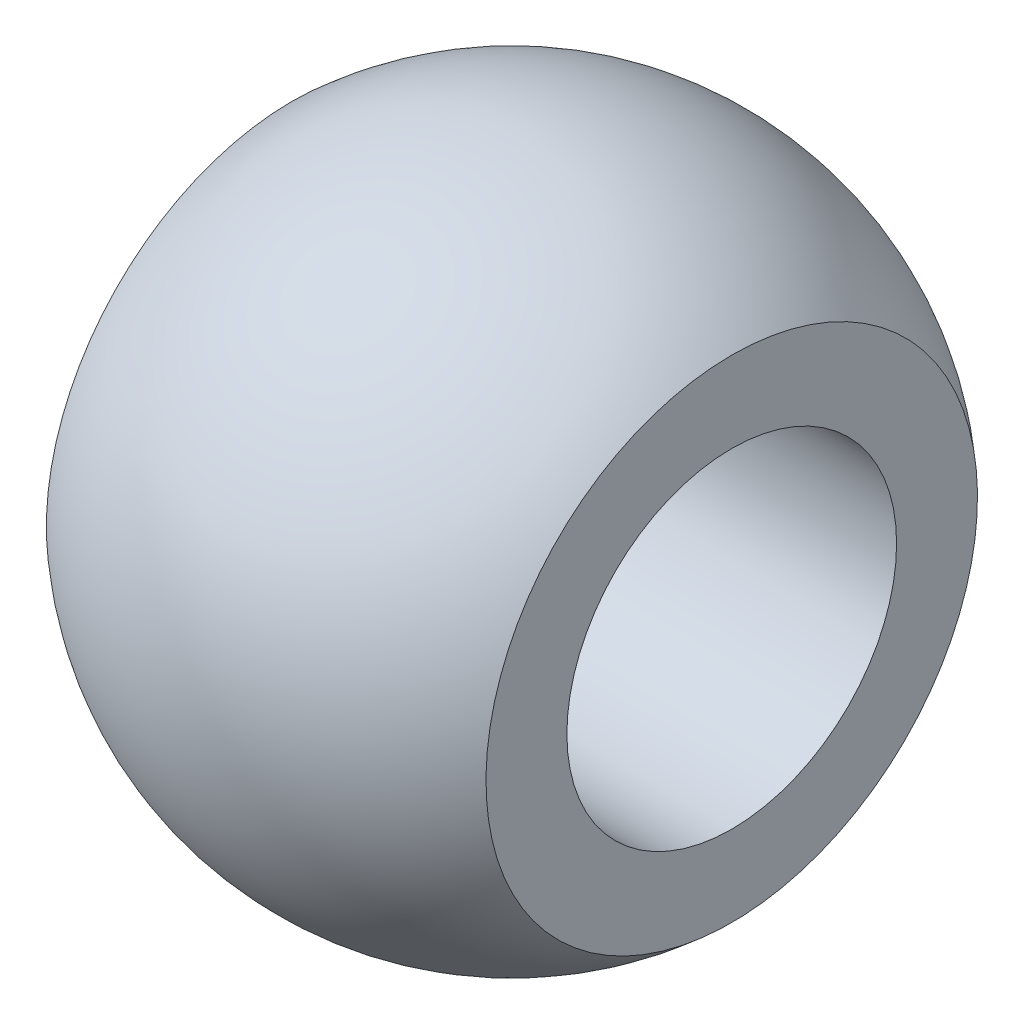
ISO-10303-21;
HEADER;
FILE_DESCRIPTION(('STEP AP214'),'2;1');
FILE_NAME('part.step','',(''),(''),'','','');
FILE_SCHEMA(('AUTOMOTIVE_DESIGN { 1 0 10303 214 1 1 1 1 }'));
ENDSEC;
DATA;
#1=APPLICATION_CONTEXT('core data for automotive mechanical design processes');
#2=APPLICATION_PROTOCOL_DEFINITION('international standard','automotive_design',2000,#1);
#3=PRODUCT_CONTEXT('',#1,'mechanical');
#4=PRODUCT('Part','Part','',(#3));
#5=PRODUCT_RELATED_PRODUCT_CATEGORY('part','',(#4));
#6=PRODUCT_DEFINITION_FORMATION('','',#4);
#7=PRODUCT_DEFINITION_CONTEXT('part definition',#1,'design');
#8=PRODUCT_DEFINITION('design','',#6,#7);
#9=PRODUCT_DEFINITION_SHAPE('','',#8);
#10=(LENGTH_UNIT() NAMED_UNIT(*) SI_UNIT(.MILLI.,.METRE.));
#11=(NAMED_UNIT(*) PLANE_ANGLE_UNIT() SI_UNIT($,.RADIAN.));
#12=(NAMED_UNIT(*) SI_UNIT($,.STERADIAN.) SOLID_ANGLE_UNIT());
#13=UNCERTAINTY_MEASURE_WITH_UNIT(LENGTH_MEASURE(1.E-05),#10,'distance_accuracy_value','');
#14=(GEOMETRIC_REPRESENTATION_CONTEXT(3) GLOBAL_UNCERTAINTY_ASSIGNED_CONTEXT((#13)) GLOBAL_UNIT_ASSIGNED_CONTEXT((#10,
#11,#12)) REPRESENTATION_CONTEXT('',''));
#15=CARTESIAN_POINT('',(0.,0.,0.));
#16=DIRECTION('',(0.,0.,1.));
#17=DIRECTION('',(1.,0.,0.));
#18=AXIS2_PLACEMENT_3D('',#15,#16,#17);
#19=CARTESIAN_POINT('',(0.,0.,0.));
#20=DIRECTION('',(0.,1.,0.));
#21=DIRECTION('',(1.,0.,0.));
#22=AXIS2_PLACEMENT_3D('',#19,#20,#21);
#23=SPHERICAL_SURFACE('',#22,12.);
#24=CARTESIAN_POINT('',(0.,0.,0.));
#25=DIRECTION('',(1.,0.,0.));
#26=DIRECTION('',(0.,1.,0.));
#27=AXIS2_PLACEMENT_3D('',#24,#25,#26);
#28=SPHERICAL_SURFACE('',#27,12.);
#29=CARTESIAN_POINT('',(8.,0.,0.));
#30=DIRECTION('',(1.,0.,0.));
#31=DIRECTION('',(0.,1.,0.));
#32=AXIS2_PLACEMENT_3D('',#29,#30,#31);
#33=CIRCLE('',#32,8.94427190999916);
#34=CARTESIAN_POINT('',(8.,8.94427190999916,0.));
#35=VERTEX_POINT('',#34);
#36=EDGE_CURVE('E45',#35,#35,#33,.F.);
#37=ORIENTED_EDGE('',*,*,#36,.T.);
#38=EDGE_LOOP('',(#37));
#39=FACE_BOUND('',#38,.T.);
#40=CARTESIAN_POINT('',(-8.,0.,0.));
#41=DIRECTION('',(-1.,0.,0.));
#42=DIRECTION('',(0.,-1.,0.));
#43=AXIS2_PLACEMENT_3D('',#40,#41,#42);
#44=CIRCLE('',#43,8.94427190999916);
#45=CARTESIAN_POINT('',(-8.,-8.94427190999916,0.));
#46=VERTEX_POINT('',#45);
#47=EDGE_CURVE('E11',#46,#46,#44,.F.);
#48=ORIENTED_EDGE('',*,*,#47,.T.);
#49=EDGE_LOOP('',(#48));
#50=FACE_BOUND('',#49,.T.);
#51=ADVANCED_FACE('F38',(#39,#50),#28,.T.);
#52=CARTESIAN_POINT('',(8.,14.6028679107736,-20.));
#53=DIRECTION('',(1.,0.,0.));
#54=DIRECTION('',(0.,1.,0.));
#55=AXIS2_PLACEMENT_3D('',#52,#53,#54);
#56=PLANE('',#55);
#57=CARTESIAN_POINT('',(8.,0.,0.));
#58=DIRECTION('',(1.,0.,0.));
#59=DIRECTION('',(0.,1.,0.));
#60=AXIS2_PLACEMENT_3D('',#57,#58,#59);
#61=CIRCLE('',#60,6.);
#62=CARTESIAN_POINT('',(8.,6.,0.));
#63=VERTEX_POINT('',#62);
#64=EDGE_CURVE('E46',#63,#63,#61,.T.);
#65=ORIENTED_EDGE('',*,*,#64,.F.);
#66=EDGE_LOOP('',(#65));
#67=FACE_BOUND('',#66,.T.);
#68=ORIENTED_EDGE('',*,*,#36,.F.);
#69=EDGE_LOOP('',(#68));
#70=FACE_BOUND('',#69,.T.);
#71=ADVANCED_FACE('F62',(#67,#70),#56,.T.);
#72=CARTESIAN_POINT('',(-8.,14.6028679107736,-20.));
#73=DIRECTION('',(-1.,0.,0.));
#74=DIRECTION('',(0.,-1.,0.));
#75=AXIS2_PLACEMENT_3D('',#72,#73,#74);
#76=PLANE('',#75);
#77=CARTESIAN_POINT('',(-8.,0.,0.));
#78=DIRECTION('',(-1.,0.,0.));
#79=DIRECTION('',(0.,-1.,0.));
#80=AXIS2_PLACEMENT_3D('',#77,#78,#79);
#81=CIRCLE('',#80,6.);
#82=CARTESIAN_POINT('',(-8.,-6.,0.));
#83=VERTEX_POINT('',#82);
#84=EDGE_CURVE('E49',#83,#83,#81,.T.);
#85=ORIENTED_EDGE('',*,*,#84,.F.);
#86=EDGE_LOOP('',(#85));
#87=FACE_BOUND('',#86,.T.);
#88=ORIENTED_EDGE('',*,*,#47,.F.);
#89=EDGE_LOOP('',(#88));
#90=FACE_BOUND('',#89,.T.);
#91=ADVANCED_FACE('F59',(#87,#90),#76,.T.);
#92=CARTESIAN_POINT('',(32.,0.,0.));
#93=DIRECTION('',(-1.,0.,0.));
#94=DIRECTION('',(0.,-1.,0.));
#95=AXIS2_PLACEMENT_3D('',#92,#93,#94);
#96=CYLINDRICAL_SURFACE('',#95,6.);
#97=ORIENTED_EDGE('',*,*,#64,.T.);
#98=EDGE_LOOP('',(#97));
#99=FACE_BOUND('',#98,.T.);
#100=ORIENTED_EDGE('',*,*,#84,.T.);
#101=EDGE_LOOP('',(#100));
#102=FACE_BOUND('',#101,.T.);
#103=ADVANCED_FACE('F57',(#99,#102),#96,.F.);
#104=CLOSED_SHELL('',(#51,#71,#91,#103));
#105=MANIFOLD_SOLID_BREP('B2',#104);
#106=ADVANCED_BREP_SHAPE_REPRESENTATION('',(#18,#105),#14);
#107=SHAPE_DEFINITION_REPRESENTATION(#9,#106);
ENDSEC;
END-ISO-10303-21;
